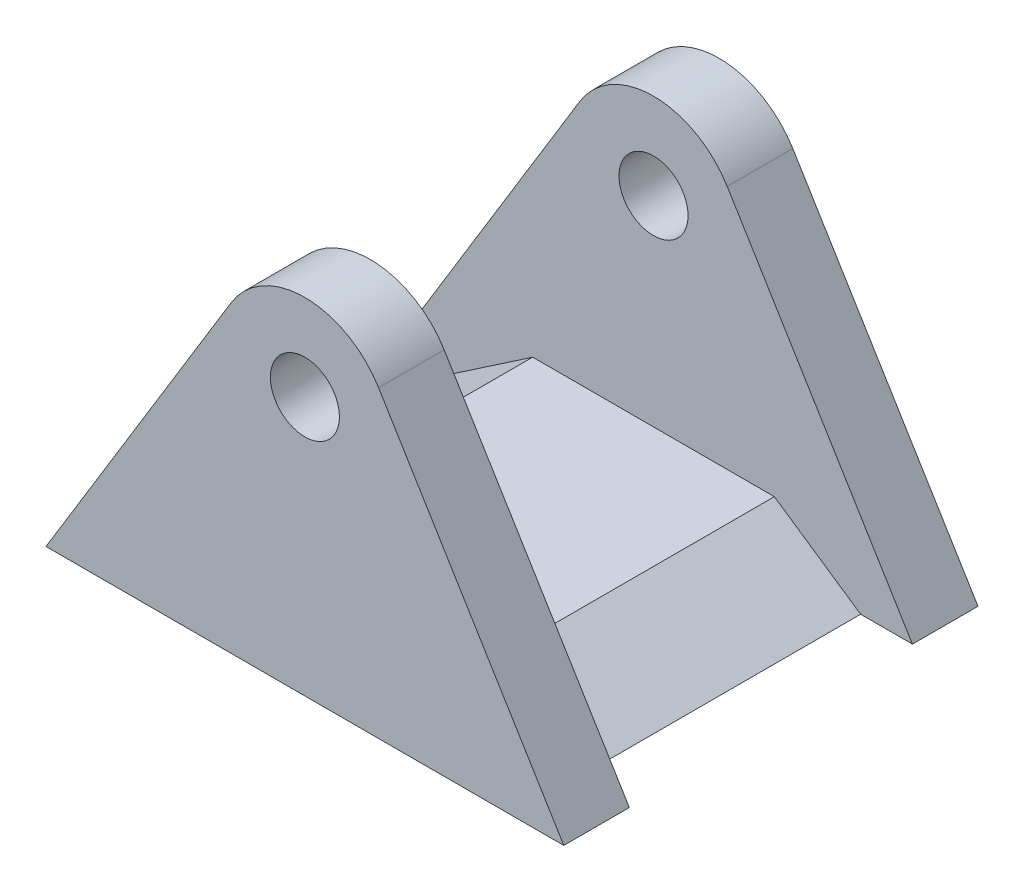
ISO-10303-21;
HEADER;
FILE_DESCRIPTION(('STEP AP214'),'2;1');
FILE_NAME('part.step','',(''),(''),'','','');
FILE_SCHEMA(('AUTOMOTIVE_DESIGN { 1 0 10303 214 1 1 1 1 }'));
ENDSEC;
DATA;
#1=APPLICATION_CONTEXT('core data for automotive mechanical design processes');
#2=APPLICATION_PROTOCOL_DEFINITION('international standard','automotive_design',2000,#1);
#3=PRODUCT_CONTEXT('',#1,'mechanical');
#4=PRODUCT('Part','Part','',(#3));
#5=PRODUCT_RELATED_PRODUCT_CATEGORY('part','',(#4));
#6=PRODUCT_DEFINITION_FORMATION('','',#4);
#7=PRODUCT_DEFINITION_CONTEXT('part definition',#1,'design');
#8=PRODUCT_DEFINITION('design','',#6,#7);
#9=PRODUCT_DEFINITION_SHAPE('','',#8);
#10=(LENGTH_UNIT() NAMED_UNIT(*) SI_UNIT(.MILLI.,.METRE.));
#11=(NAMED_UNIT(*) PLANE_ANGLE_UNIT() SI_UNIT($,.RADIAN.));
#12=(NAMED_UNIT(*) SI_UNIT($,.STERADIAN.) SOLID_ANGLE_UNIT());
#13=UNCERTAINTY_MEASURE_WITH_UNIT(LENGTH_MEASURE(1.E-05),#10,'distance_accuracy_value','');
#14=(GEOMETRIC_REPRESENTATION_CONTEXT(3) GLOBAL_UNCERTAINTY_ASSIGNED_CONTEXT((#13)) GLOBAL_UNIT_ASSIGNED_CONTEXT((#10,
#11,#12)) REPRESENTATION_CONTEXT('',''));
#15=CARTESIAN_POINT('',(0.,0.,0.));
#16=DIRECTION('',(0.,0.,1.));
#17=DIRECTION('',(1.,0.,0.));
#18=AXIS2_PLACEMENT_3D('',#15,#16,#17);
#19=CARTESIAN_POINT('',(1.95,-2.5,-2.));
#20=DIRECTION('',(1.,0.,0.));
#21=DIRECTION('',(0.,1.,0.));
#22=AXIS2_PLACEMENT_3D('',#19,#20,#21);
#23=PLANE('',#22);
#24=DIRECTION('',(0.,-1.,0.));
#25=VECTOR('',#24,1.);
#26=CARTESIAN_POINT('',(1.95,-2.5,1.95));
#27=LINE('',#26,#25);
#28=CARTESIAN_POINT('',(1.95,-1.55559027913422,1.95));
#29=VERTEX_POINT('',#28);
#30=CARTESIAN_POINT('',(1.95,-2.4,1.95));
#31=VERTEX_POINT('',#30);
#32=EDGE_CURVE('E513',#29,#31,#27,.T.);
#33=ORIENTED_EDGE('',*,*,#32,.T.);
#34=DIRECTION('',(0.,0.,1.));
#35=VECTOR('',#34,1.);
#36=CARTESIAN_POINT('',(1.95,-2.4,-2.));
#37=LINE('',#36,#35);
#38=CARTESIAN_POINT('',(1.95,-2.4,-1.95));
#39=VERTEX_POINT('',#38);
#40=EDGE_CURVE('E11',#31,#39,#37,.F.);
#41=ORIENTED_EDGE('',*,*,#40,.T.);
#42=DIRECTION('',(0.,1.,0.));
#43=VECTOR('',#42,1.);
#44=CARTESIAN_POINT('',(1.95,-2.5,-1.95));
#45=LINE('',#44,#43);
#46=CARTESIAN_POINT('',(1.95,-1.55559027913422,-1.95));
#47=VERTEX_POINT('',#46);
#48=EDGE_CURVE('E511',#39,#47,#45,.T.);
#49=ORIENTED_EDGE('',*,*,#48,.T.);
#50=DIRECTION('',(0.,0.,1.));
#51=VECTOR('',#50,1.);
#52=CARTESIAN_POINT('',(1.95,-1.55559027913422,-2.));
#53=LINE('',#52,#51);
#54=EDGE_CURVE('E215',#47,#29,#53,.T.);
#55=ORIENTED_EDGE('',*,*,#54,.T.);
#56=EDGE_LOOP('',(#33,#41,#49,#55));
#57=FACE_BOUND('',#56,.T.);
#58=ADVANCED_FACE('F34',(#57),#23,.T.);
#59=CARTESIAN_POINT('',(1.95,-2.5,-2.));
#60=DIRECTION('',(0.,-1.,0.));
#61=DIRECTION('',(0.,0.,-1.));
#62=AXIS2_PLACEMENT_3D('',#59,#60,#61);
#63=PLANE('',#62);
#64=DIRECTION('',(0.,0.,1.));
#65=VECTOR('',#64,1.);
#66=CARTESIAN_POINT('',(-1.85,-2.5,-2.));
#67=LINE('',#66,#65);
#68=CARTESIAN_POINT('',(-1.85,-2.5,1.85));
#69=VERTEX_POINT('',#68);
#70=CARTESIAN_POINT('',(-1.85,-2.5,-1.85));
#71=VERTEX_POINT('',#70);
#72=EDGE_CURVE('E486',#69,#71,#67,.F.);
#73=ORIENTED_EDGE('',*,*,#72,.T.);
#74=DIRECTION('',(-1.,0.,0.));
#75=VECTOR('',#74,1.);
#76=CARTESIAN_POINT('',(1.95,-2.5,-1.85));
#77=LINE('',#76,#75);
#78=CARTESIAN_POINT('',(1.85,-2.5,-1.85));
#79=VERTEX_POINT('',#78);
#80=EDGE_CURVE('E484',#71,#79,#77,.F.);
#81=ORIENTED_EDGE('',*,*,#80,.T.);
#82=DIRECTION('',(0.,0.,1.));
#83=VECTOR('',#82,1.);
#84=CARTESIAN_POINT('',(1.85,-2.5,-2.));
#85=LINE('',#84,#83);
#86=CARTESIAN_POINT('',(1.85,-2.5,1.85));
#87=VERTEX_POINT('',#86);
#88=EDGE_CURVE('E470',#79,#87,#85,.T.);
#89=ORIENTED_EDGE('',*,*,#88,.T.);
#90=DIRECTION('',(-1.,0.,0.));
#91=VECTOR('',#90,1.);
#92=CARTESIAN_POINT('',(1.95,-2.5,1.85));
#93=LINE('',#92,#91);
#94=EDGE_CURVE('E488',#87,#69,#93,.T.);
#95=ORIENTED_EDGE('',*,*,#94,.T.);
#96=EDGE_LOOP('',(#73,#81,#89,#95));
#97=FACE_BOUND('',#96,.T.);
#98=ADVANCED_FACE('F396',(#97),#63,.T.);
#99=CARTESIAN_POINT('',(-1.95,-2.5,-2.));
#100=DIRECTION('',(-1.,0.,0.));
#101=DIRECTION('',(0.,-1.,0.));
#102=AXIS2_PLACEMENT_3D('',#99,#100,#101);
#103=PLANE('',#102);
#104=DIRECTION('',(0.,-1.,0.));
#105=VECTOR('',#104,1.);
#106=CARTESIAN_POINT('',(-1.95,-2.5,-1.95));
#107=LINE('',#106,#105);
#108=CARTESIAN_POINT('',(-1.95,-1.55559027913422,-1.95));
#109=VERTEX_POINT('',#108);
#110=CARTESIAN_POINT('',(-1.95,-2.4,-1.95));
#111=VERTEX_POINT('',#110);
#112=EDGE_CURVE('E512',#109,#111,#107,.T.);
#113=ORIENTED_EDGE('',*,*,#112,.T.);
#114=DIRECTION('',(0.,0.,1.));
#115=VECTOR('',#114,1.);
#116=CARTESIAN_POINT('',(-1.95,-2.4,-2.));
#117=LINE('',#116,#115);
#118=CARTESIAN_POINT('',(-1.95,-2.4,1.95));
#119=VERTEX_POINT('',#118);
#120=EDGE_CURVE('E58',#111,#119,#117,.T.);
#121=ORIENTED_EDGE('',*,*,#120,.T.);
#122=DIRECTION('',(0.,1.,0.));
#123=VECTOR('',#122,1.);
#124=CARTESIAN_POINT('',(-1.95,-2.5,1.95));
#125=LINE('',#124,#123);
#126=CARTESIAN_POINT('',(-1.95,-1.55559027913422,1.95));
#127=VERTEX_POINT('',#126);
#128=EDGE_CURVE('E517',#119,#127,#125,.T.);
#129=ORIENTED_EDGE('',*,*,#128,.T.);
#130=DIRECTION('',(0.,0.,1.));
#131=VECTOR('',#130,1.);
#132=CARTESIAN_POINT('',(-1.95,-1.55559027913422,-2.));
#133=LINE('',#132,#131);
#134=EDGE_CURVE('E229',#109,#127,#133,.T.);
#135=ORIENTED_EDGE('',*,*,#134,.F.);
#136=EDGE_LOOP('',(#113,#121,#129,#135));
#137=FACE_BOUND('',#136,.T.);
#138=ADVANCED_FACE('F402',(#137),#103,.T.);
#139=CARTESIAN_POINT('',(0.,-2.,-2.));
#140=DIRECTION('',(0.,0.,1.));
#141=DIRECTION('',(1.,0.,0.));
#142=AXIS2_PLACEMENT_3D('',#139,#140,#141);
#143=CYLINDRICAL_SURFACE('',#142,2.);
#144=ORIENTED_EDGE('',*,*,#134,.T.);
#145=CARTESIAN_POINT('',(0.,-2.,0.));
#146=DIRECTION('',(0.707106781186547,0.,0.707106781186547));
#147=DIRECTION('',(-0.707106781186547,0.,0.707106781186547));
#148=AXIS2_PLACEMENT_3D('',#145,#146,#147);
#149=ELLIPSE('',#148,2.82842712474619,2.);
#150=CARTESIAN_POINT('',(-1.5,-0.677124344467705,1.5));
#151=VERTEX_POINT('',#150);
#152=EDGE_CURVE('E539',#127,#151,#149,.F.);
#153=ORIENTED_EDGE('',*,*,#152,.T.);
#154=DIRECTION('',(0.,0.,1.));
#155=VECTOR('',#154,1.);
#156=CARTESIAN_POINT('',(-1.5,-0.677124344467705,-2.));
#157=LINE('',#156,#155);
#158=CARTESIAN_POINT('',(-1.5,-0.677124344467704,-1.5));
#159=VERTEX_POINT('',#158);
#160=EDGE_CURVE('E213',#159,#151,#157,.T.);
#161=ORIENTED_EDGE('',*,*,#160,.F.);
#162=CARTESIAN_POINT('',(0.,-2.,0.));
#163=DIRECTION('',(-0.707106781186547,0.,0.707106781186547));
#164=DIRECTION('',(0.707106781186547,0.,0.707106781186547));
#165=AXIS2_PLACEMENT_3D('',#162,#163,#164);
#166=ELLIPSE('',#165,2.82842712474619,2.);
#167=EDGE_CURVE('E524',#159,#109,#166,.T.);
#168=ORIENTED_EDGE('',*,*,#167,.T.);
#169=EDGE_LOOP('',(#144,#153,#161,#168));
#170=FACE_BOUND('',#169,.T.);
#171=ADVANCED_FACE('F536',(#170),#143,.T.);
#172=CARTESIAN_POINT('',(-1.5,0.,-2.));
#173=DIRECTION('',(-1.,0.,0.));
#174=DIRECTION('',(0.,-1.,0.));
#175=AXIS2_PLACEMENT_3D('',#172,#173,#174);
#176=PLANE('',#175);
#177=ORIENTED_EDGE('',*,*,#160,.T.);
#178=DIRECTION('',(0.,1.,0.));
#179=VECTOR('',#178,1.);
#180=CARTESIAN_POINT('',(-1.5,0.,1.5));
#181=LINE('',#180,#179);
#182=CARTESIAN_POINT('',(-1.5,0.,1.5));
#183=VERTEX_POINT('',#182);
#184=EDGE_CURVE('E195',#151,#183,#181,.T.);
#185=ORIENTED_EDGE('',*,*,#184,.T.);
#186=DIRECTION('',(0.,0.,1.));
#187=VECTOR('',#186,1.);
#188=CARTESIAN_POINT('',(-1.5,0.,-2.));
#189=LINE('',#188,#187);
#190=CARTESIAN_POINT('',(-1.5,0.,-1.5));
#191=VERTEX_POINT('',#190);
#192=EDGE_CURVE('E206',#191,#183,#189,.T.);
#193=ORIENTED_EDGE('',*,*,#192,.F.);
#194=DIRECTION('',(0.,-1.,0.));
#195=VECTOR('',#194,1.);
#196=CARTESIAN_POINT('',(-1.5,0.,-1.5));
#197=LINE('',#196,#195);
#198=EDGE_CURVE('E221',#191,#159,#197,.T.);
#199=ORIENTED_EDGE('',*,*,#198,.T.);
#200=EDGE_LOOP('',(#177,#185,#193,#199));
#201=FACE_BOUND('',#200,.T.);
#202=ADVANCED_FACE('F533',(#201),#176,.T.);
#203=CARTESIAN_POINT('',(1.5,0.,-2.));
#204=DIRECTION('',(1.,0.,0.));
#205=DIRECTION('',(0.,1.,0.));
#206=AXIS2_PLACEMENT_3D('',#203,#204,#205);
#207=PLANE('',#206);
#208=DIRECTION('',(0.,0.,1.));
#209=VECTOR('',#208,1.);
#210=CARTESIAN_POINT('',(1.5,0.,-2.));
#211=LINE('',#210,#209);
#212=CARTESIAN_POINT('',(1.5,0.,-1.5));
#213=VERTEX_POINT('',#212);
#214=CARTESIAN_POINT('',(1.5,0.,1.5));
#215=VERTEX_POINT('',#214);
#216=EDGE_CURVE('E204',#213,#215,#211,.T.);
#217=ORIENTED_EDGE('',*,*,#216,.T.);
#218=DIRECTION('',(0.,-1.,0.));
#219=VECTOR('',#218,1.);
#220=CARTESIAN_POINT('',(1.5,0.,1.5));
#221=LINE('',#220,#219);
#222=CARTESIAN_POINT('',(1.5,-0.677124344467705,1.5));
#223=VERTEX_POINT('',#222);
#224=EDGE_CURVE('E184',#215,#223,#221,.T.);
#225=ORIENTED_EDGE('',*,*,#224,.T.);
#226=DIRECTION('',(0.,0.,1.));
#227=VECTOR('',#226,1.);
#228=CARTESIAN_POINT('',(1.5,-0.677124344467705,-2.));
#229=LINE('',#228,#227);
#230=CARTESIAN_POINT('',(1.5,-0.677124344467704,-1.5));
#231=VERTEX_POINT('',#230);
#232=EDGE_CURVE('E211',#231,#223,#229,.T.);
#233=ORIENTED_EDGE('',*,*,#232,.F.);
#234=DIRECTION('',(0.,1.,0.));
#235=VECTOR('',#234,1.);
#236=CARTESIAN_POINT('',(1.5,0.,-1.5));
#237=LINE('',#236,#235);
#238=EDGE_CURVE('E210',#231,#213,#237,.T.);
#239=ORIENTED_EDGE('',*,*,#238,.T.);
#240=EDGE_LOOP('',(#217,#225,#233,#239));
#241=FACE_BOUND('',#240,.T.);
#242=ADVANCED_FACE('F209',(#241),#207,.T.);
#243=CARTESIAN_POINT('',(0.,-2.,-2.));
#244=DIRECTION('',(0.,0.,1.));
#245=DIRECTION('',(1.,0.,0.));
#246=AXIS2_PLACEMENT_3D('',#243,#244,#245);
#247=CYLINDRICAL_SURFACE('',#246,2.);
#248=ORIENTED_EDGE('',*,*,#232,.T.);
#249=CARTESIAN_POINT('',(0.,-2.,0.));
#250=DIRECTION('',(-0.707106781186547,0.,0.707106781186547));
#251=DIRECTION('',(0.707106781186547,0.,0.707106781186547));
#252=AXIS2_PLACEMENT_3D('',#249,#250,#251);
#253=ELLIPSE('',#252,2.82842712474619,2.);
#254=EDGE_CURVE('E493',#223,#29,#253,.F.);
#255=ORIENTED_EDGE('',*,*,#254,.T.);
#256=ORIENTED_EDGE('',*,*,#54,.F.);
#257=CARTESIAN_POINT('',(0.,-2.,0.));
#258=DIRECTION('',(0.707106781186547,0.,0.707106781186547));
#259=DIRECTION('',(-0.707106781186547,0.,0.707106781186547));
#260=AXIS2_PLACEMENT_3D('',#257,#258,#259);
#261=ELLIPSE('',#260,2.82842712474619,2.);
#262=EDGE_CURVE('E307',#47,#231,#261,.T.);
#263=ORIENTED_EDGE('',*,*,#262,.T.);
#264=EDGE_LOOP('',(#248,#255,#256,#263));
#265=FACE_BOUND('',#264,.T.);
#266=ADVANCED_FACE('F407',(#265),#247,.T.);
#267=CARTESIAN_POINT('',(-3.5,1.7,-4.1));
#268=DIRECTION('',(-0.562310021407279,0.826926502069528,0.));
#269=DIRECTION('',(-0.826926502069528,-0.562310021407279,0.));
#270=AXIS2_PLACEMENT_3D('',#267,#268,#269);
#271=PLANE('',#270);
#272=DIRECTION('',(0.,0.,1.));
#273=VECTOR('',#272,1.);
#274=CARTESIAN_POINT('',(-6.,0.,-4.1));
#275=LINE('',#274,#273);
#276=CARTESIAN_POINT('',(-6.,0.,-4.1));
#277=VERTEX_POINT('',#276);
#278=CARTESIAN_POINT('',(-6.,0.,4.1));
#279=VERTEX_POINT('',#278);
#280=EDGE_CURVE('E279',#277,#279,#275,.T.);
#281=ORIENTED_EDGE('',*,*,#280,.T.);
#282=DIRECTION('',(-0.826926502069528,-0.562310021407279,0.));
#283=VECTOR('',#282,1.);
#284=CARTESIAN_POINT('',(-3.5,1.7,4.1));
#285=LINE('',#284,#283);
#286=CARTESIAN_POINT('',(-3.5,1.7,4.1));
#287=VERTEX_POINT('',#286);
#288=EDGE_CURVE('E321',#287,#279,#285,.T.);
#289=ORIENTED_EDGE('',*,*,#288,.F.);
#290=DIRECTION('',(0.,0.,1.));
#291=VECTOR('',#290,1.);
#292=CARTESIAN_POINT('',(-3.5,1.7,-4.1));
#293=LINE('',#292,#291);
#294=CARTESIAN_POINT('',(-3.5,1.7,-4.1));
#295=VERTEX_POINT('',#294);
#296=EDGE_CURVE('E293',#295,#287,#293,.T.);
#297=ORIENTED_EDGE('',*,*,#296,.F.);
#298=DIRECTION('',(-0.826926502069528,-0.562310021407279,0.));
#299=VECTOR('',#298,1.);
#300=CARTESIAN_POINT('',(-3.5,1.7,-4.1));
#301=LINE('',#300,#299);
#302=EDGE_CURVE('E290',#295,#277,#301,.T.);
#303=ORIENTED_EDGE('',*,*,#302,.T.);
#304=EDGE_LOOP('',(#281,#289,#297,#303));
#305=FACE_BOUND('',#304,.T.);
#306=ADVANCED_FACE('F291',(#305),#271,.T.);
#307=CARTESIAN_POINT('',(-3.5,1.7,-4.1));
#308=DIRECTION('',(0.,1.,0.));
#309=DIRECTION('',(0.,0.,1.));
#310=AXIS2_PLACEMENT_3D('',#307,#308,#309);
#311=PLANE('',#310);
#312=ORIENTED_EDGE('',*,*,#296,.T.);
#313=DIRECTION('',(-1.,0.,0.));
#314=VECTOR('',#313,1.);
#315=CARTESIAN_POINT('',(-3.5,1.7,4.1));
#316=LINE('',#315,#314);
#317=CARTESIAN_POINT('',(3.5,1.7,4.1));
#318=VERTEX_POINT('',#317);
#319=EDGE_CURVE('E296',#318,#287,#316,.T.);
#320=ORIENTED_EDGE('',*,*,#319,.F.);
#321=DIRECTION('',(0.,0.,1.));
#322=VECTOR('',#321,1.);
#323=CARTESIAN_POINT('',(3.5,1.7,-4.1));
#324=LINE('',#323,#322);
#325=CARTESIAN_POINT('',(3.5,1.7,-4.1));
#326=VERTEX_POINT('',#325);
#327=EDGE_CURVE('E314',#326,#318,#324,.T.);
#328=ORIENTED_EDGE('',*,*,#327,.F.);
#329=DIRECTION('',(-1.,0.,0.));
#330=VECTOR('',#329,1.);
#331=CARTESIAN_POINT('',(-3.5,1.7,-4.1));
#332=LINE('',#331,#330);
#333=EDGE_CURVE('E287',#326,#295,#332,.T.);
#334=ORIENTED_EDGE('',*,*,#333,.T.);
#335=EDGE_LOOP('',(#312,#320,#328,#334));
#336=FACE_BOUND('',#335,.T.);
#337=ADVANCED_FACE('F437',(#336),#311,.T.);
#338=CARTESIAN_POINT('',(3.5,1.7,-4.1));
#339=DIRECTION('',(0.562310021407279,0.826926502069528,0.));
#340=DIRECTION('',(-0.826926502069528,0.562310021407279,0.));
#341=AXIS2_PLACEMENT_3D('',#338,#339,#340);
#342=PLANE('',#341);
#343=ORIENTED_EDGE('',*,*,#327,.T.);
#344=DIRECTION('',(-0.826926502069528,0.562310021407279,0.));
#345=VECTOR('',#344,1.);
#346=CARTESIAN_POINT('',(3.5,1.7,4.1));
#347=LINE('',#346,#345);
#348=CARTESIAN_POINT('',(6.,0.,4.1));
#349=VERTEX_POINT('',#348);
#350=EDGE_CURVE('E301',#349,#318,#347,.T.);
#351=ORIENTED_EDGE('',*,*,#350,.F.);
#352=DIRECTION('',(0.,0.,1.));
#353=VECTOR('',#352,1.);
#354=CARTESIAN_POINT('',(6.,0.,-4.1));
#355=LINE('',#354,#353);
#356=CARTESIAN_POINT('',(6.,0.,-4.1));
#357=VERTEX_POINT('',#356);
#358=EDGE_CURVE('E286',#357,#349,#355,.T.);
#359=ORIENTED_EDGE('',*,*,#358,.F.);
#360=DIRECTION('',(-0.826926502069528,0.562310021407279,0.));
#361=VECTOR('',#360,1.);
#362=CARTESIAN_POINT('',(3.5,1.7,-4.1));
#363=LINE('',#362,#361);
#364=EDGE_CURVE('E295',#357,#326,#363,.T.);
#365=ORIENTED_EDGE('',*,*,#364,.T.);
#366=EDGE_LOOP('',(#343,#351,#359,#365));
#367=FACE_BOUND('',#366,.T.);
#368=ADVANCED_FACE('F433',(#367),#342,.T.);
#369=CARTESIAN_POINT('',(-6.,0.,-4.1));
#370=DIRECTION('',(0.,-1.,0.));
#371=DIRECTION('',(0.,0.,-1.));
#372=AXIS2_PLACEMENT_3D('',#369,#370,#371);
#373=PLANE('',#372);
#374=DIRECTION('',(-1.,0.,0.));
#375=VECTOR('',#374,1.);
#376=CARTESIAN_POINT('',(2.,0.,1.5));
#377=LINE('',#376,#375);
#378=EDGE_CURVE('E187',#215,#183,#377,.T.);
#379=ORIENTED_EDGE('',*,*,#378,.F.);
#380=ORIENTED_EDGE('',*,*,#216,.F.);
#381=DIRECTION('',(-1.,0.,0.));
#382=VECTOR('',#381,1.);
#383=CARTESIAN_POINT('',(2.,0.,-1.5));
#384=LINE('',#383,#382);
#385=EDGE_CURVE('E515',#213,#191,#384,.T.);
#386=ORIENTED_EDGE('',*,*,#385,.T.);
#387=ORIENTED_EDGE('',*,*,#192,.T.);
#388=EDGE_LOOP('',(#379,#380,#386,#387));
#389=FACE_BOUND('',#388,.T.);
#390=ORIENTED_EDGE('',*,*,#358,.T.);
#391=DIRECTION('',(1.,0.,0.));
#392=VECTOR('',#391,1.);
#393=CARTESIAN_POINT('',(0.,0.,4.1));
#394=LINE('',#393,#392);
#395=CARTESIAN_POINT('',(7.5,0.,4.1));
#396=VERTEX_POINT('',#395);
#397=EDGE_CURVE('E329',#349,#396,#394,.T.);
#398=ORIENTED_EDGE('',*,*,#397,.T.);
#399=DIRECTION('',(0.,0.,-1.));
#400=VECTOR('',#399,1.);
#401=CARTESIAN_POINT('',(7.5,0.,6.));
#402=LINE('',#401,#400);
#403=CARTESIAN_POINT('',(7.5,0.,6.));
#404=VERTEX_POINT('',#403);
#405=EDGE_CURVE('E326',#404,#396,#402,.T.);
#406=ORIENTED_EDGE('',*,*,#405,.F.);
#407=DIRECTION('',(1.,0.,0.));
#408=VECTOR('',#407,1.);
#409=CARTESIAN_POINT('',(0.,0.,6.));
#410=LINE('',#409,#408);
#411=CARTESIAN_POINT('',(-7.5,0.,6.));
#412=VERTEX_POINT('',#411);
#413=EDGE_CURVE('E356',#412,#404,#410,.T.);
#414=ORIENTED_EDGE('',*,*,#413,.F.);
#415=DIRECTION('',(0.,0.,-1.));
#416=VECTOR('',#415,1.);
#417=CARTESIAN_POINT('',(-7.5,0.,6.));
#418=LINE('',#417,#416);
#419=CARTESIAN_POINT('',(-7.5,0.,4.1));
#420=VERTEX_POINT('',#419);
#421=EDGE_CURVE('E338',#412,#420,#418,.T.);
#422=ORIENTED_EDGE('',*,*,#421,.T.);
#423=EDGE_CURVE('E283',#420,#279,#394,.T.);
#424=ORIENTED_EDGE('',*,*,#423,.T.);
#425=ORIENTED_EDGE('',*,*,#280,.F.);
#426=DIRECTION('',(1.,0.,0.));
#427=VECTOR('',#426,1.);
#428=CARTESIAN_POINT('',(0.,0.,-4.1));
#429=LINE('',#428,#427);
#430=CARTESIAN_POINT('',(-7.5,0.,-4.1));
#431=VERTEX_POINT('',#430);
#432=EDGE_CURVE('E252',#431,#277,#429,.T.);
#433=ORIENTED_EDGE('',*,*,#432,.F.);
#434=DIRECTION('',(0.,0.,1.));
#435=VECTOR('',#434,1.);
#436=CARTESIAN_POINT('',(-7.5,0.,-6.));
#437=LINE('',#436,#435);
#438=CARTESIAN_POINT('',(-7.5,0.,-6.));
#439=VERTEX_POINT('',#438);
#440=EDGE_CURVE('E254',#439,#431,#437,.T.);
#441=ORIENTED_EDGE('',*,*,#440,.F.);
#442=DIRECTION('',(1.,0.,0.));
#443=VECTOR('',#442,1.);
#444=CARTESIAN_POINT('',(0.,0.,-6.));
#445=LINE('',#444,#443);
#446=CARTESIAN_POINT('',(7.5,0.,-6.));
#447=VERTEX_POINT('',#446);
#448=EDGE_CURVE('E230',#439,#447,#445,.T.);
#449=ORIENTED_EDGE('',*,*,#448,.T.);
#450=DIRECTION('',(0.,0.,1.));
#451=VECTOR('',#450,1.);
#452=CARTESIAN_POINT('',(7.5,0.,-6.));
#453=LINE('',#452,#451);
#454=CARTESIAN_POINT('',(7.5,0.,-4.1));
#455=VERTEX_POINT('',#454);
#456=EDGE_CURVE('E243',#447,#455,#453,.T.);
#457=ORIENTED_EDGE('',*,*,#456,.T.);
#458=EDGE_CURVE('E225',#357,#455,#429,.T.);
#459=ORIENTED_EDGE('',*,*,#458,.F.);
#460=EDGE_LOOP('',(#390,#398,#406,#414,#422,#424,#425,#433,#441,#449,#457,#459));
#461=FACE_BOUND('',#460,.T.);
#462=ADVANCED_FACE('F201',(#389,#461),#373,.T.);
#463=CARTESIAN_POINT('',(0.,7.5,4.1));
#464=DIRECTION('',(0.,0.,1.));
#465=DIRECTION('',(1.,0.,0.));
#466=AXIS2_PLACEMENT_3D('',#463,#464,#465);
#467=PLANE('',#466);
#468=CARTESIAN_POINT('',(0.,7.5,4.1));
#469=DIRECTION('',(0.,0.,1.));
#470=DIRECTION('',(1.,0.,0.));
#471=AXIS2_PLACEMENT_3D('',#468,#469,#470);
#472=CIRCLE('',#471,1.);
#473=CARTESIAN_POINT('',(-1.,7.5,4.1));
#474=VERTEX_POINT('',#473);
#475=EDGE_CURVE('E256',#474,#474,#472,.T.);
#476=ORIENTED_EDGE('',*,*,#475,.T.);
#477=EDGE_LOOP('',(#476));
#478=FACE_BOUND('',#477,.T.);
#479=ORIENTED_EDGE('',*,*,#319,.T.);
#480=ORIENTED_EDGE('',*,*,#288,.T.);
#481=ORIENTED_EDGE('',*,*,#423,.F.);
#482=DIRECTION('',(-0.52051760426961,-0.853850937602944,0.));
#483=VECTOR('',#482,1.);
#484=CARTESIAN_POINT('',(-7.5,0.,4.1));
#485=LINE('',#484,#483);
#486=CARTESIAN_POINT('',(-2.13462734400736,8.80129401067403,4.1));
#487=VERTEX_POINT('',#486);
#488=EDGE_CURVE('E332',#487,#420,#485,.T.);
#489=ORIENTED_EDGE('',*,*,#488,.F.);
#490=CARTESIAN_POINT('',(0.,7.5,4.1));
#491=DIRECTION('',(0.,0.,1.));
#492=DIRECTION('',(1.,0.,0.));
#493=AXIS2_PLACEMENT_3D('',#490,#491,#492);
#494=CIRCLE('',#493,2.5);
#495=CARTESIAN_POINT('',(2.13462734400736,8.80129401067403,4.1));
#496=VERTEX_POINT('',#495);
#497=EDGE_CURVE('E366',#496,#487,#494,.T.);
#498=ORIENTED_EDGE('',*,*,#497,.F.);
#499=DIRECTION('',(-0.52051760426961,0.853850937602943,0.));
#500=VECTOR('',#499,1.);
#501=CARTESIAN_POINT('',(7.5,0.,4.1));
#502=LINE('',#501,#500);
#503=EDGE_CURVE('E353',#396,#496,#502,.T.);
#504=ORIENTED_EDGE('',*,*,#503,.F.);
#505=ORIENTED_EDGE('',*,*,#397,.F.);
#506=ORIENTED_EDGE('',*,*,#350,.T.);
#507=EDGE_LOOP('',(#479,#480,#481,#489,#498,#504,#505,#506));
#508=FACE_BOUND('',#507,.T.);
#509=ADVANCED_FACE('F364',(#478,#508),#467,.F.);
#510=CARTESIAN_POINT('',(0.,7.5,6.));
#511=DIRECTION('',(0.,0.,1.));
#512=DIRECTION('',(1.,0.,0.));
#513=AXIS2_PLACEMENT_3D('',#510,#511,#512);
#514=PLANE('',#513);
#515=ORIENTED_EDGE('',*,*,#413,.T.);
#516=DIRECTION('',(-0.52051760426961,0.853850937602943,0.));
#517=VECTOR('',#516,1.);
#518=CARTESIAN_POINT('',(7.5,0.,6.));
#519=LINE('',#518,#517);
#520=CARTESIAN_POINT('',(2.13462734400736,8.80129401067403,6.));
#521=VERTEX_POINT('',#520);
#522=EDGE_CURVE('E354',#404,#521,#519,.T.);
#523=ORIENTED_EDGE('',*,*,#522,.T.);
#524=CARTESIAN_POINT('',(0.,7.5,6.));
#525=DIRECTION('',(0.,0.,1.));
#526=DIRECTION('',(1.,0.,0.));
#527=AXIS2_PLACEMENT_3D('',#524,#525,#526);
#528=CIRCLE('',#527,2.5);
#529=CARTESIAN_POINT('',(-2.13462734400736,8.80129401067403,6.));
#530=VERTEX_POINT('',#529);
#531=EDGE_CURVE('E372',#521,#530,#528,.T.);
#532=ORIENTED_EDGE('',*,*,#531,.T.);
#533=DIRECTION('',(-0.52051760426961,-0.853850937602944,0.));
#534=VECTOR('',#533,1.);
#535=CARTESIAN_POINT('',(-7.5,0.,6.));
#536=LINE('',#535,#534);
#537=EDGE_CURVE('E342',#530,#412,#536,.T.);
#538=ORIENTED_EDGE('',*,*,#537,.T.);
#539=EDGE_LOOP('',(#515,#523,#532,#538));
#540=FACE_BOUND('',#539,.T.);
#541=CARTESIAN_POINT('',(0.,7.5,6.));
#542=DIRECTION('',(0.,0.,1.));
#543=DIRECTION('',(1.,0.,0.));
#544=AXIS2_PLACEMENT_3D('',#541,#542,#543);
#545=CIRCLE('',#544,1.);
#546=CARTESIAN_POINT('',(-1.,7.5,6.));
#547=VERTEX_POINT('',#546);
#548=EDGE_CURVE('E367',#547,#547,#545,.T.);
#549=ORIENTED_EDGE('',*,*,#548,.F.);
#550=EDGE_LOOP('',(#549));
#551=FACE_BOUND('',#550,.T.);
#552=ADVANCED_FACE('F741',(#540,#551),#514,.T.);
#553=CARTESIAN_POINT('',(7.5,0.,6.));
#554=DIRECTION('',(-0.853850937602943,-0.52051760426961,0.));
#555=DIRECTION('',(0.52051760426961,-0.853850937602943,0.));
#556=AXIS2_PLACEMENT_3D('',#553,#554,#555);
#557=PLANE('',#556);
#558=ORIENTED_EDGE('',*,*,#503,.T.);
#559=DIRECTION('',(0.,0.,-1.));
#560=VECTOR('',#559,1.);
#561=CARTESIAN_POINT('',(2.13462734400736,8.80129401067403,6.));
#562=LINE('',#561,#560);
#563=EDGE_CURVE('E345',#521,#496,#562,.T.);
#564=ORIENTED_EDGE('',*,*,#563,.F.);
#565=ORIENTED_EDGE('',*,*,#522,.F.);
#566=ORIENTED_EDGE('',*,*,#405,.T.);
#567=EDGE_LOOP('',(#558,#564,#565,#566));
#568=FACE_BOUND('',#567,.T.);
#569=ADVANCED_FACE('F350',(#568),#557,.F.);
#570=CARTESIAN_POINT('',(0.,7.5,6.));
#571=DIRECTION('',(0.,0.,-1.));
#572=DIRECTION('',(-1.,0.,0.));
#573=AXIS2_PLACEMENT_3D('',#570,#571,#572);
#574=CYLINDRICAL_SURFACE('',#573,2.5);
#575=ORIENTED_EDGE('',*,*,#497,.T.);
#576=DIRECTION('',(0.,0.,-1.));
#577=VECTOR('',#576,1.);
#578=CARTESIAN_POINT('',(-2.13462734400736,8.80129401067403,6.));
#579=LINE('',#578,#577);
#580=EDGE_CURVE('E341',#530,#487,#579,.T.);
#581=ORIENTED_EDGE('',*,*,#580,.F.);
#582=ORIENTED_EDGE('',*,*,#531,.F.);
#583=ORIENTED_EDGE('',*,*,#563,.T.);
#584=EDGE_LOOP('',(#575,#581,#582,#583));
#585=FACE_BOUND('',#584,.T.);
#586=ADVANCED_FACE('F391',(#585),#574,.T.);
#587=CARTESIAN_POINT('',(-7.5,0.,6.));
#588=DIRECTION('',(0.853850937602943,-0.52051760426961,0.));
#589=DIRECTION('',(0.52051760426961,0.853850937602944,0.));
#590=AXIS2_PLACEMENT_3D('',#587,#588,#589);
#591=PLANE('',#590);
#592=ORIENTED_EDGE('',*,*,#488,.T.);
#593=ORIENTED_EDGE('',*,*,#421,.F.);
#594=ORIENTED_EDGE('',*,*,#537,.F.);
#595=ORIENTED_EDGE('',*,*,#580,.T.);
#596=EDGE_LOOP('',(#592,#593,#594,#595));
#597=FACE_BOUND('',#596,.T.);
#598=ADVANCED_FACE('F382',(#597),#591,.F.);
#599=CARTESIAN_POINT('',(0.,7.5,6.));
#600=DIRECTION('',(0.,0.,-1.));
#601=DIRECTION('',(-1.,0.,0.));
#602=AXIS2_PLACEMENT_3D('',#599,#600,#601);
#603=CYLINDRICAL_SURFACE('',#602,1.);
#604=CARTESIAN_POINT('',(-1.,7.5,6.));
#605=CARTESIAN_POINT('',(-1.,7.5,5.98020833333333));
#606=CARTESIAN_POINT('',(-1.,7.5,5.96041666666667));
#607=CARTESIAN_POINT('',(-1.,7.5,5.92083333333333));
#608=CARTESIAN_POINT('',(-1.,7.5,5.90104166666667));
#609=CARTESIAN_POINT('',(-1.,7.5,5.86145833333333));
#610=CARTESIAN_POINT('',(-1.,7.5,5.84166666666667));
#611=CARTESIAN_POINT('',(-1.,7.5,5.80208333333333));
#612=CARTESIAN_POINT('',(-1.,7.5,5.78229166666667));
#613=CARTESIAN_POINT('',(-1.,7.5,5.74270833333333));
#614=CARTESIAN_POINT('',(-1.,7.5,5.72291666666667));
#615=CARTESIAN_POINT('',(-1.,7.5,5.68333333333333));
#616=CARTESIAN_POINT('',(-1.,7.5,5.66354166666667));
#617=CARTESIAN_POINT('',(-1.,7.5,5.62395833333333));
#618=CARTESIAN_POINT('',(-1.,7.5,5.60416666666667));
#619=CARTESIAN_POINT('',(-1.,7.5,5.56458333333333));
#620=CARTESIAN_POINT('',(-1.,7.5,5.54479166666667));
#621=CARTESIAN_POINT('',(-1.,7.5,5.50520833333333));
#622=CARTESIAN_POINT('',(-1.,7.5,5.48541666666667));
#623=CARTESIAN_POINT('',(-1.,7.5,5.44583333333333));
#624=CARTESIAN_POINT('',(-1.,7.5,5.42604166666667));
#625=CARTESIAN_POINT('',(-1.,7.5,5.38645833333333));
#626=CARTESIAN_POINT('',(-1.,7.5,5.36666666666667));
#627=CARTESIAN_POINT('',(-1.,7.5,5.32708333333333));
#628=CARTESIAN_POINT('',(-1.,7.5,5.30729166666667));
#629=CARTESIAN_POINT('',(-1.,7.5,5.26770833333333));
#630=CARTESIAN_POINT('',(-1.,7.5,5.24791666666667));
#631=CARTESIAN_POINT('',(-1.,7.5,5.20833333333333));
#632=CARTESIAN_POINT('',(-1.,7.5,5.18854166666666));
#633=CARTESIAN_POINT('',(-1.,7.5,5.14895833333333));
#634=CARTESIAN_POINT('',(-1.,7.5,5.12916666666667));
#635=CARTESIAN_POINT('',(-1.,7.5,5.08958333333333));
#636=CARTESIAN_POINT('',(-1.,7.5,5.06979166666667));
#637=CARTESIAN_POINT('',(-1.,7.5,5.03020833333333));
#638=CARTESIAN_POINT('',(-1.,7.5,5.01041666666667));
#639=CARTESIAN_POINT('',(-1.,7.5,4.97083333333333));
#640=CARTESIAN_POINT('',(-1.,7.5,4.95104166666667));
#641=CARTESIAN_POINT('',(-1.,7.5,4.91145833333333));
#642=CARTESIAN_POINT('',(-1.,7.5,4.89166666666667));
#643=CARTESIAN_POINT('',(-1.,7.5,4.85208333333333));
#644=CARTESIAN_POINT('',(-1.,7.5,4.83229166666667));
#645=CARTESIAN_POINT('',(-1.,7.5,4.79270833333333));
#646=CARTESIAN_POINT('',(-1.,7.5,4.77291666666667));
#647=CARTESIAN_POINT('',(-1.,7.5,4.73333333333333));
#648=CARTESIAN_POINT('',(-1.,7.5,4.71354166666667));
#649=CARTESIAN_POINT('',(-1.,7.5,4.67395833333333));
#650=CARTESIAN_POINT('',(-1.,7.5,4.65416666666667));
#651=CARTESIAN_POINT('',(-1.,7.5,4.61458333333333));
#652=CARTESIAN_POINT('',(-1.,7.5,4.59479166666667));
#653=CARTESIAN_POINT('',(-1.,7.5,4.55520833333333));
#654=CARTESIAN_POINT('',(-1.,7.5,4.53541666666667));
#655=CARTESIAN_POINT('',(-1.,7.5,4.49583333333333));
#656=CARTESIAN_POINT('',(-1.,7.5,4.47604166666667));
#657=CARTESIAN_POINT('',(-1.,7.5,4.43645833333333));
#658=CARTESIAN_POINT('',(-1.,7.5,4.41666666666667));
#659=CARTESIAN_POINT('',(-1.,7.5,4.37708333333333));
#660=CARTESIAN_POINT('',(-1.,7.5,4.35729166666667));
#661=CARTESIAN_POINT('',(-1.,7.5,4.31770833333333));
#662=CARTESIAN_POINT('',(-1.,7.5,4.29791666666667));
#663=CARTESIAN_POINT('',(-1.,7.5,4.25833333333333));
#664=CARTESIAN_POINT('',(-1.,7.5,4.23854166666667));
#665=CARTESIAN_POINT('',(-1.,7.5,4.19895833333333));
#666=CARTESIAN_POINT('',(-1.,7.5,4.17916666666667));
#667=CARTESIAN_POINT('',(-1.,7.5,4.13958333333333));
#668=CARTESIAN_POINT('',(-1.,7.5,4.11979166666667));
#669=CARTESIAN_POINT('',(-1.,7.5,4.1));
#670=B_SPLINE_CURVE_WITH_KNOTS('',3,(#604,#605,#606,#607,#608,#609,#610,#611,#612,#613,#614,
#615,#616,#617,#618,#619,#620,#621,#622,#623,#624,#625,#626,#627,#628,#629,#630,#631,#632,#633,
#634,#635,#636,#637,#638,#639,#640,#641,#642,#643,#644,#645,#646,#647,#648,#649,#650,#651,#652,
#653,#654,#655,#656,#657,#658,#659,#660,#661,#662,#663,#664,#665,#666,#667,#668,#669),
.UNSPECIFIED.,.F.,.F.,(4,2,2,2,2,2,2,2,2,2,2,2,2,2,2,2,2,2,2,2,2,2,2,2,2,2,2,2,2,2,2,2,4),(0.,
0.0593750000000004,0.118750000000001,0.178125,0.237500000000001,0.296875,0.356250000000001,
0.415625,0.475000000000001,0.534375,0.593750000000001,0.653125,0.7125,0.771875000000001,0.83125,
0.890625000000001,0.95,1.009375,1.06875,1.128125,1.1875,1.246875,1.30625,1.365625,1.425,
1.484375,1.54375,1.603125,1.6625,1.721875,1.78125,1.840625,1.9),.UNSPECIFIED.);
#671=EDGE_CURVE('BSEAM380',#547,#474,#670,.T.);
#672=ORIENTED_EDGE('',*,*,#548,.T.);
#673=ORIENTED_EDGE('',*,*,#475,.F.);
#674=ORIENTED_EDGE('',*,*,#671,.T.);
#675=ORIENTED_EDGE('',*,*,#671,.F.);
#676=EDGE_LOOP('',(#672,#674,#673,#675));
#677=FACE_BOUND('',#676,.T.);
#678=ADVANCED_FACE('F380',(#677),#603,.F.);
#679=CARTESIAN_POINT('',(-7.5,0.,-6.));
#680=DIRECTION('',(-0.853850937602943,0.52051760426961,0.));
#681=DIRECTION('',(-0.52051760426961,-0.853850937602944,0.));
#682=AXIS2_PLACEMENT_3D('',#679,#680,#681);
#683=PLANE('',#682);
#684=DIRECTION('',(-0.52051760426961,-0.853850937602944,0.));
#685=VECTOR('',#684,1.);
#686=CARTESIAN_POINT('',(-7.5,0.,-4.1));
#687=LINE('',#686,#685);
#688=CARTESIAN_POINT('',(-2.13462734400736,8.80129401067403,-4.1));
#689=VERTEX_POINT('',#688);
#690=EDGE_CURVE('E246',#689,#431,#687,.T.);
#691=ORIENTED_EDGE('',*,*,#690,.F.);
#692=DIRECTION('',(0.,0.,1.));
#693=VECTOR('',#692,1.);
#694=CARTESIAN_POINT('',(-2.13462734400736,8.80129401067403,-6.));
#695=LINE('',#694,#693);
#696=CARTESIAN_POINT('',(-2.13462734400736,8.80129401067403,-6.));
#697=VERTEX_POINT('',#696);
#698=EDGE_CURVE('E257',#697,#689,#695,.T.);
#699=ORIENTED_EDGE('',*,*,#698,.F.);
#700=DIRECTION('',(-0.52051760426961,-0.853850937602944,0.));
#701=VECTOR('',#700,1.);
#702=CARTESIAN_POINT('',(-7.5,0.,-6.));
#703=LINE('',#702,#701);
#704=EDGE_CURVE('E233',#697,#439,#703,.T.);
#705=ORIENTED_EDGE('',*,*,#704,.T.);
#706=ORIENTED_EDGE('',*,*,#440,.T.);
#707=EDGE_LOOP('',(#691,#699,#705,#706));
#708=FACE_BOUND('',#707,.T.);
#709=ADVANCED_FACE('F275',(#708),#683,.T.);
#710=CARTESIAN_POINT('',(0.,7.5,-6.));
#711=DIRECTION('',(0.,0.,1.));
#712=DIRECTION('',(1.,0.,0.));
#713=AXIS2_PLACEMENT_3D('',#710,#711,#712);
#714=CYLINDRICAL_SURFACE('',#713,2.5);
#715=CARTESIAN_POINT('',(0.,7.5,-4.1));
#716=DIRECTION('',(0.,0.,1.));
#717=DIRECTION('',(1.,0.,0.));
#718=AXIS2_PLACEMENT_3D('',#715,#716,#717);
#719=CIRCLE('',#718,2.5);
#720=CARTESIAN_POINT('',(2.13462734400736,8.80129401067403,-4.1));
#721=VERTEX_POINT('',#720);
#722=EDGE_CURVE('E264',#721,#689,#719,.T.);
#723=ORIENTED_EDGE('',*,*,#722,.F.);
#724=DIRECTION('',(0.,0.,1.));
#725=VECTOR('',#724,1.);
#726=CARTESIAN_POINT('',(2.13462734400736,8.80129401067403,-6.));
#727=LINE('',#726,#725);
#728=CARTESIAN_POINT('',(2.13462734400736,8.80129401067403,-6.));
#729=VERTEX_POINT('',#728);
#730=EDGE_CURVE('E259',#729,#721,#727,.T.);
#731=ORIENTED_EDGE('',*,*,#730,.F.);
#732=CARTESIAN_POINT('',(0.,7.5,-6.));
#733=DIRECTION('',(0.,0.,1.));
#734=DIRECTION('',(1.,0.,0.));
#735=AXIS2_PLACEMENT_3D('',#732,#733,#734);
#736=CIRCLE('',#735,2.5);
#737=EDGE_CURVE('E237',#729,#697,#736,.T.);
#738=ORIENTED_EDGE('',*,*,#737,.T.);
#739=ORIENTED_EDGE('',*,*,#698,.T.);
#740=EDGE_LOOP('',(#723,#731,#738,#739));
#741=FACE_BOUND('',#740,.T.);
#742=ADVANCED_FACE('F389',(#741),#714,.T.);
#743=CARTESIAN_POINT('',(7.5,0.,-6.));
#744=DIRECTION('',(0.853850937602943,0.52051760426961,0.));
#745=DIRECTION('',(-0.52051760426961,0.853850937602943,0.));
#746=AXIS2_PLACEMENT_3D('',#743,#744,#745);
#747=PLANE('',#746);
#748=DIRECTION('',(-0.52051760426961,0.853850937602943,0.));
#749=VECTOR('',#748,1.);
#750=CARTESIAN_POINT('',(7.5,0.,-4.1));
#751=LINE('',#750,#749);
#752=EDGE_CURVE('E234',#455,#721,#751,.T.);
#753=ORIENTED_EDGE('',*,*,#752,.F.);
#754=ORIENTED_EDGE('',*,*,#456,.F.);
#755=DIRECTION('',(-0.52051760426961,0.853850937602943,0.));
#756=VECTOR('',#755,1.);
#757=CARTESIAN_POINT('',(7.5,0.,-6.));
#758=LINE('',#757,#756);
#759=EDGE_CURVE('E240',#447,#729,#758,.T.);
#760=ORIENTED_EDGE('',*,*,#759,.T.);
#761=ORIENTED_EDGE('',*,*,#730,.T.);
#762=EDGE_LOOP('',(#753,#754,#760,#761));
#763=FACE_BOUND('',#762,.T.);
#764=ADVANCED_FACE('F417',(#763),#747,.T.);
#765=CARTESIAN_POINT('',(0.,7.5,-6.));
#766=DIRECTION('',(0.,0.,-1.));
#767=DIRECTION('',(1.,0.,0.));
#768=AXIS2_PLACEMENT_3D('',#765,#766,#767);
#769=PLANE('',#768);
#770=CARTESIAN_POINT('',(0.,7.5,-6.));
#771=DIRECTION('',(0.,0.,1.));
#772=DIRECTION('',(1.,0.,0.));
#773=AXIS2_PLACEMENT_3D('',#770,#771,#772);
#774=CIRCLE('',#773,1.);
#775=CARTESIAN_POINT('',(1.,7.5,-6.));
#776=VERTEX_POINT('',#775);
#777=EDGE_CURVE('E222',#776,#776,#774,.T.);
#778=ORIENTED_EDGE('',*,*,#777,.T.);
#779=EDGE_LOOP('',(#778));
#780=FACE_BOUND('',#779,.T.);
#781=ORIENTED_EDGE('',*,*,#448,.F.);
#782=ORIENTED_EDGE('',*,*,#704,.F.);
#783=ORIENTED_EDGE('',*,*,#737,.F.);
#784=ORIENTED_EDGE('',*,*,#759,.F.);
#785=EDGE_LOOP('',(#781,#782,#783,#784));
#786=FACE_BOUND('',#785,.T.);
#787=ADVANCED_FACE('F414',(#780,#786),#769,.T.);
#788=CARTESIAN_POINT('',(0.,7.5,-4.1));
#789=DIRECTION('',(0.,0.,-1.));
#790=DIRECTION('',(1.,0.,0.));
#791=AXIS2_PLACEMENT_3D('',#788,#789,#790);
#792=PLANE('',#791);
#793=ORIENTED_EDGE('',*,*,#302,.F.);
#794=ORIENTED_EDGE('',*,*,#333,.F.);
#795=ORIENTED_EDGE('',*,*,#364,.F.);
#796=ORIENTED_EDGE('',*,*,#458,.T.);
#797=ORIENTED_EDGE('',*,*,#752,.T.);
#798=ORIENTED_EDGE('',*,*,#722,.T.);
#799=ORIENTED_EDGE('',*,*,#690,.T.);
#800=ORIENTED_EDGE('',*,*,#432,.T.);
#801=EDGE_LOOP('',(#793,#794,#795,#796,#797,#798,#799,#800));
#802=FACE_BOUND('',#801,.T.);
#803=CARTESIAN_POINT('',(0.,7.5,-4.1));
#804=DIRECTION('',(0.,0.,1.));
#805=DIRECTION('',(1.,0.,0.));
#806=AXIS2_PLACEMENT_3D('',#803,#804,#805);
#807=CIRCLE('',#806,1.);
#808=CARTESIAN_POINT('',(1.,7.5,-4.1));
#809=VERTEX_POINT('',#808);
#810=EDGE_CURVE('E226',#809,#809,#807,.T.);
#811=ORIENTED_EDGE('',*,*,#810,.F.);
#812=EDGE_LOOP('',(#811));
#813=FACE_BOUND('',#812,.T.);
#814=ADVANCED_FACE('F270',(#802,#813),#792,.F.);
#815=CARTESIAN_POINT('',(0.,7.5,-6.));
#816=DIRECTION('',(0.,0.,1.));
#817=DIRECTION('',(1.,0.,0.));
#818=AXIS2_PLACEMENT_3D('',#815,#816,#817);
#819=CYLINDRICAL_SURFACE('',#818,1.);
#820=CARTESIAN_POINT('',(1.,7.5,-6.));
#821=CARTESIAN_POINT('',(1.,7.5,-5.98020833333333));
#822=CARTESIAN_POINT('',(1.,7.5,-5.96041666666667));
#823=CARTESIAN_POINT('',(1.,7.5,-5.92083333333333));
#824=CARTESIAN_POINT('',(1.,7.5,-5.90104166666667));
#825=CARTESIAN_POINT('',(1.,7.5,-5.86145833333333));
#826=CARTESIAN_POINT('',(1.,7.5,-5.84166666666667));
#827=CARTESIAN_POINT('',(1.,7.5,-5.80208333333333));
#828=CARTESIAN_POINT('',(1.,7.5,-5.78229166666667));
#829=CARTESIAN_POINT('',(1.,7.5,-5.74270833333333));
#830=CARTESIAN_POINT('',(1.,7.5,-5.72291666666667));
#831=CARTESIAN_POINT('',(1.,7.5,-5.68333333333333));
#832=CARTESIAN_POINT('',(1.,7.5,-5.66354166666667));
#833=CARTESIAN_POINT('',(1.,7.5,-5.62395833333333));
#834=CARTESIAN_POINT('',(1.,7.5,-5.60416666666667));
#835=CARTESIAN_POINT('',(1.,7.5,-5.56458333333333));
#836=CARTESIAN_POINT('',(1.,7.5,-5.54479166666667));
#837=CARTESIAN_POINT('',(1.,7.5,-5.50520833333333));
#838=CARTESIAN_POINT('',(1.,7.5,-5.48541666666667));
#839=CARTESIAN_POINT('',(1.,7.5,-5.44583333333333));
#840=CARTESIAN_POINT('',(1.,7.5,-5.42604166666667));
#841=CARTESIAN_POINT('',(1.,7.5,-5.38645833333333));
#842=CARTESIAN_POINT('',(1.,7.5,-5.36666666666667));
#843=CARTESIAN_POINT('',(1.,7.5,-5.32708333333333));
#844=CARTESIAN_POINT('',(1.,7.5,-5.30729166666667));
#845=CARTESIAN_POINT('',(1.,7.5,-5.26770833333333));
#846=CARTESIAN_POINT('',(1.,7.5,-5.24791666666667));
#847=CARTESIAN_POINT('',(1.,7.5,-5.20833333333333));
#848=CARTESIAN_POINT('',(1.,7.5,-5.18854166666667));
#849=CARTESIAN_POINT('',(1.,7.5,-5.14895833333333));
#850=CARTESIAN_POINT('',(1.,7.5,-5.12916666666667));
#851=CARTESIAN_POINT('',(1.,7.5,-5.08958333333333));
#852=CARTESIAN_POINT('',(1.,7.5,-5.06979166666667));
#853=CARTESIAN_POINT('',(1.,7.5,-5.03020833333333));
#854=CARTESIAN_POINT('',(1.,7.5,-5.01041666666667));
#855=CARTESIAN_POINT('',(1.,7.5,-4.97083333333333));
#856=CARTESIAN_POINT('',(1.,7.5,-4.95104166666667));
#857=CARTESIAN_POINT('',(1.,7.5,-4.91145833333333));
#858=CARTESIAN_POINT('',(1.,7.5,-4.89166666666667));
#859=CARTESIAN_POINT('',(1.,7.5,-4.85208333333333));
#860=CARTESIAN_POINT('',(1.,7.5,-4.83229166666667));
#861=CARTESIAN_POINT('',(1.,7.5,-4.79270833333333));
#862=CARTESIAN_POINT('',(1.,7.5,-4.77291666666667));
#863=CARTESIAN_POINT('',(1.,7.5,-4.73333333333333));
#864=CARTESIAN_POINT('',(1.,7.5,-4.71354166666667));
#865=CARTESIAN_POINT('',(1.,7.5,-4.67395833333333));
#866=CARTESIAN_POINT('',(1.,7.5,-4.65416666666667));
#867=CARTESIAN_POINT('',(1.,7.5,-4.61458333333333));
#868=CARTESIAN_POINT('',(1.,7.5,-4.59479166666667));
#869=CARTESIAN_POINT('',(1.,7.5,-4.55520833333333));
#870=CARTESIAN_POINT('',(1.,7.5,-4.53541666666667));
#871=CARTESIAN_POINT('',(1.,7.5,-4.49583333333333));
#872=CARTESIAN_POINT('',(1.,7.5,-4.47604166666667));
#873=CARTESIAN_POINT('',(1.,7.5,-4.43645833333333));
#874=CARTESIAN_POINT('',(1.,7.5,-4.41666666666667));
#875=CARTESIAN_POINT('',(1.,7.5,-4.37708333333333));
#876=CARTESIAN_POINT('',(1.,7.5,-4.35729166666667));
#877=CARTESIAN_POINT('',(1.,7.5,-4.31770833333333));
#878=CARTESIAN_POINT('',(1.,7.5,-4.29791666666667));
#879=CARTESIAN_POINT('',(1.,7.5,-4.25833333333333));
#880=CARTESIAN_POINT('',(1.,7.5,-4.23854166666667));
#881=CARTESIAN_POINT('',(1.,7.5,-4.19895833333333));
#882=CARTESIAN_POINT('',(1.,7.5,-4.17916666666667));
#883=CARTESIAN_POINT('',(1.,7.5,-4.13958333333333));
#884=CARTESIAN_POINT('',(1.,7.5,-4.11979166666667));
#885=CARTESIAN_POINT('',(1.,7.5,-4.1));
#886=B_SPLINE_CURVE_WITH_KNOTS('',3,(#820,#821,#822,#823,#824,#825,#826,#827,#828,#829,#830,
#831,#832,#833,#834,#835,#836,#837,#838,#839,#840,#841,#842,#843,#844,#845,#846,#847,#848,#849,
#850,#851,#852,#853,#854,#855,#856,#857,#858,#859,#860,#861,#862,#863,#864,#865,#866,#867,#868,
#869,#870,#871,#872,#873,#874,#875,#876,#877,#878,#879,#880,#881,#882,#883,#884,#885),
.UNSPECIFIED.,.F.,.F.,(4,2,2,2,2,2,2,2,2,2,2,2,2,2,2,2,2,2,2,2,2,2,2,2,2,2,2,2,2,2,2,2,4),(0.,
0.0593749999999995,0.11875,0.178124999999999,0.2375,0.296874999999999,0.35625,0.415624999999999,
0.475,0.534374999999999,0.59375,0.653124999999999,0.7125,0.771874999999999,0.831249999999999,
0.890624999999999,0.95,1.009375,1.06875,1.128125,1.1875,1.246875,1.30625,1.365625,1.425,
1.484375,1.54375,1.603125,1.6625,1.721875,1.78125,1.840625,1.9),.UNSPECIFIED.);
#887=EDGE_CURVE('BSEAM409',#776,#809,#886,.T.);
#888=ORIENTED_EDGE('',*,*,#777,.F.);
#889=ORIENTED_EDGE('',*,*,#810,.T.);
#890=ORIENTED_EDGE('',*,*,#887,.T.);
#891=ORIENTED_EDGE('',*,*,#887,.F.);
#892=EDGE_LOOP('',(#888,#890,#889,#891));
#893=FACE_BOUND('',#892,.T.);
#894=ADVANCED_FACE('F409',(#893),#819,.F.);
#895=CARTESIAN_POINT('',(2.,0.,-1.5));
#896=DIRECTION('',(0.,0.,-1.));
#897=DIRECTION('',(-1.,0.,0.));
#898=AXIS2_PLACEMENT_3D('',#895,#896,#897);
#899=PLANE('',#898);
#900=ORIENTED_EDGE('',*,*,#385,.F.);
#901=ORIENTED_EDGE('',*,*,#238,.F.);
#902=DIRECTION('',(-1.,0.,0.));
#903=VECTOR('',#902,1.);
#904=CARTESIAN_POINT('',(2.,-0.677124344467704,-1.5));
#905=LINE('',#904,#903);
#906=EDGE_CURVE('E507',#231,#159,#905,.T.);
#907=ORIENTED_EDGE('',*,*,#906,.T.);
#908=ORIENTED_EDGE('',*,*,#198,.F.);
#909=EDGE_LOOP('',(#900,#901,#907,#908));
#910=FACE_BOUND('',#909,.T.);
#911=ADVANCED_FACE('F412',(#910),#899,.T.);
#912=CARTESIAN_POINT('',(2.,-2.,0.));
#913=DIRECTION('',(-1.,0.,0.));
#914=DIRECTION('',(0.,0.,1.));
#915=AXIS2_PLACEMENT_3D('',#912,#913,#914);
#916=CYLINDRICAL_SURFACE('',#915,2.);
#917=ORIENTED_EDGE('',*,*,#906,.F.);
#918=ORIENTED_EDGE('',*,*,#262,.F.);
#919=DIRECTION('',(-1.,0.,0.));
#920=VECTOR('',#919,1.);
#921=CARTESIAN_POINT('',(2.,-1.55559027913422,-1.95));
#922=LINE('',#921,#920);
#923=EDGE_CURVE('E504',#47,#109,#922,.T.);
#924=ORIENTED_EDGE('',*,*,#923,.T.);
#925=ORIENTED_EDGE('',*,*,#167,.F.);
#926=EDGE_LOOP('',(#917,#918,#924,#925));
#927=FACE_BOUND('',#926,.T.);
#928=ADVANCED_FACE('F503',(#927),#916,.T.);
#929=CARTESIAN_POINT('',(2.,-2.5,-1.95));
#930=DIRECTION('',(0.,0.,-1.));
#931=DIRECTION('',(-1.,0.,0.));
#932=AXIS2_PLACEMENT_3D('',#929,#930,#931);
#933=PLANE('',#932);
#934=ORIENTED_EDGE('',*,*,#48,.F.);
#935=DIRECTION('',(-1.,0.,0.));
#936=VECTOR('',#935,1.);
#937=CARTESIAN_POINT('',(2.,-2.4,-1.95));
#938=LINE('',#937,#936);
#939=EDGE_CURVE('E491',#39,#111,#938,.T.);
#940=ORIENTED_EDGE('',*,*,#939,.T.);
#941=ORIENTED_EDGE('',*,*,#112,.F.);
#942=ORIENTED_EDGE('',*,*,#923,.F.);
#943=EDGE_LOOP('',(#934,#940,#941,#942));
#944=FACE_BOUND('',#943,.T.);
#945=ADVANCED_FACE('F510',(#944),#933,.T.);
#946=CARTESIAN_POINT('',(2.,-2.5,1.95));
#947=DIRECTION('',(0.,0.,1.));
#948=DIRECTION('',(1.,0.,0.));
#949=AXIS2_PLACEMENT_3D('',#946,#947,#948);
#950=PLANE('',#949);
#951=ORIENTED_EDGE('',*,*,#128,.F.);
#952=DIRECTION('',(-1.,0.,0.));
#953=VECTOR('',#952,1.);
#954=CARTESIAN_POINT('',(2.,-2.4,1.95));
#955=LINE('',#954,#953);
#956=EDGE_CURVE('E43',#119,#31,#955,.F.);
#957=ORIENTED_EDGE('',*,*,#956,.T.);
#958=ORIENTED_EDGE('',*,*,#32,.F.);
#959=DIRECTION('',(-1.,0.,0.));
#960=VECTOR('',#959,1.);
#961=CARTESIAN_POINT('',(2.,-1.55559027913422,1.95));
#962=LINE('',#961,#960);
#963=EDGE_CURVE('E196',#29,#127,#962,.T.);
#964=ORIENTED_EDGE('',*,*,#963,.T.);
#965=EDGE_LOOP('',(#951,#957,#958,#964));
#966=FACE_BOUND('',#965,.T.);
#967=ADVANCED_FACE('F548',(#966),#950,.T.);
#968=CARTESIAN_POINT('',(2.,-2.,0.));
#969=DIRECTION('',(-1.,0.,0.));
#970=DIRECTION('',(0.,0.,1.));
#971=AXIS2_PLACEMENT_3D('',#968,#969,#970);
#972=CYLINDRICAL_SURFACE('',#971,2.);
#973=ORIENTED_EDGE('',*,*,#963,.F.);
#974=ORIENTED_EDGE('',*,*,#254,.F.);
#975=DIRECTION('',(-1.,0.,0.));
#976=VECTOR('',#975,1.);
#977=CARTESIAN_POINT('',(2.,-0.677124344467705,1.5));
#978=LINE('',#977,#976);
#979=EDGE_CURVE('E190',#223,#151,#978,.T.);
#980=ORIENTED_EDGE('',*,*,#979,.T.);
#981=ORIENTED_EDGE('',*,*,#152,.F.);
#982=EDGE_LOOP('',(#973,#974,#980,#981));
#983=FACE_BOUND('',#982,.T.);
#984=ADVANCED_FACE('F547',(#983),#972,.T.);
#985=CARTESIAN_POINT('',(2.,0.,1.5));
#986=DIRECTION('',(0.,0.,1.));
#987=DIRECTION('',(1.,0.,0.));
#988=AXIS2_PLACEMENT_3D('',#985,#986,#987);
#989=PLANE('',#988);
#990=ORIENTED_EDGE('',*,*,#979,.F.);
#991=ORIENTED_EDGE('',*,*,#224,.F.);
#992=ORIENTED_EDGE('',*,*,#378,.T.);
#993=ORIENTED_EDGE('',*,*,#184,.F.);
#994=EDGE_LOOP('',(#990,#991,#992,#993));
#995=FACE_BOUND('',#994,.T.);
#996=ADVANCED_FACE('F186',(#995),#989,.T.);
#997=CARTESIAN_POINT('',(1.95,-2.4,1.85));
#998=DIRECTION('',(-1.,0.,0.));
#999=DIRECTION('',(0.,0.,1.));
#1000=AXIS2_PLACEMENT_3D('',#997,#998,#999);
#1001=CYLINDRICAL_SURFACE('',#1000,0.1);
#1002=CARTESIAN_POINT('',(-1.85,-2.4,1.85));
#1003=DIRECTION('',(-0.707106781186547,0.,-0.707106781186547));
#1004=DIRECTION('',(-0.707106781186547,0.,0.707106781186547));
#1005=AXIS2_PLACEMENT_3D('',#1002,#1003,#1004);
#1006=ELLIPSE('',#1005,0.14142135623731,0.1);
#1007=EDGE_CURVE('E473',#69,#119,#1006,.T.);
#1008=ORIENTED_EDGE('',*,*,#1007,.F.);
#1009=ORIENTED_EDGE('',*,*,#94,.F.);
#1010=CARTESIAN_POINT('',(1.85,-2.4,1.85));
#1011=DIRECTION('',(-0.707106781186547,0.,0.707106781186547));
#1012=DIRECTION('',(0.707106781186547,0.,0.707106781186547));
#1013=AXIS2_PLACEMENT_3D('',#1010,#1011,#1012);
#1014=ELLIPSE('',#1013,0.14142135623731,0.1);
#1015=EDGE_CURVE('E38',#31,#87,#1014,.F.);
#1016=ORIENTED_EDGE('',*,*,#1015,.F.);
#1017=ORIENTED_EDGE('',*,*,#956,.F.);
#1018=EDGE_LOOP('',(#1008,#1009,#1016,#1017));
#1019=FACE_BOUND('',#1018,.T.);
#1020=ADVANCED_FACE('F36',(#1019),#1001,.T.);
#1021=CARTESIAN_POINT('',(1.85,-2.4,-2.));
#1022=DIRECTION('',(0.,0.,1.));
#1023=DIRECTION('',(1.,0.,0.));
#1024=AXIS2_PLACEMENT_3D('',#1021,#1022,#1023);
#1025=CYLINDRICAL_SURFACE('',#1024,0.1);
#1026=ORIENTED_EDGE('',*,*,#1015,.T.);
#1027=ORIENTED_EDGE('',*,*,#88,.F.);
#1028=CARTESIAN_POINT('',(1.85,-2.4,-1.85));
#1029=DIRECTION('',(0.707106781186547,0.,0.707106781186547));
#1030=DIRECTION('',(-0.707106781186547,0.,0.707106781186547));
#1031=AXIS2_PLACEMENT_3D('',#1028,#1029,#1030);
#1032=ELLIPSE('',#1031,0.14142135623731,0.1);
#1033=EDGE_CURVE('E475',#39,#79,#1032,.F.);
#1034=ORIENTED_EDGE('',*,*,#1033,.F.);
#1035=ORIENTED_EDGE('',*,*,#40,.F.);
#1036=EDGE_LOOP('',(#1026,#1027,#1034,#1035));
#1037=FACE_BOUND('',#1036,.T.);
#1038=ADVANCED_FACE('F457',(#1037),#1025,.T.);
#1039=CARTESIAN_POINT('',(-1.85,-2.4,-2.));
#1040=DIRECTION('',(0.,0.,1.));
#1041=DIRECTION('',(1.,0.,0.));
#1042=AXIS2_PLACEMENT_3D('',#1039,#1040,#1041);
#1043=CYLINDRICAL_SURFACE('',#1042,0.1);
#1044=ORIENTED_EDGE('',*,*,#1007,.T.);
#1045=ORIENTED_EDGE('',*,*,#120,.F.);
#1046=CARTESIAN_POINT('',(-1.85,-2.4,-1.85));
#1047=DIRECTION('',(-0.707106781186547,0.,0.707106781186547));
#1048=DIRECTION('',(0.707106781186547,0.,0.707106781186547));
#1049=AXIS2_PLACEMENT_3D('',#1046,#1047,#1048);
#1050=ELLIPSE('',#1049,0.14142135623731,0.1);
#1051=EDGE_CURVE('E478',#71,#111,#1050,.F.);
#1052=ORIENTED_EDGE('',*,*,#1051,.F.);
#1053=ORIENTED_EDGE('',*,*,#72,.F.);
#1054=EDGE_LOOP('',(#1044,#1045,#1052,#1053));
#1055=FACE_BOUND('',#1054,.T.);
#1056=ADVANCED_FACE('F454',(#1055),#1043,.T.);
#1057=CARTESIAN_POINT('',(2.,-2.4,-1.85));
#1058=DIRECTION('',(-1.,0.,0.));
#1059=DIRECTION('',(0.,0.,1.));
#1060=AXIS2_PLACEMENT_3D('',#1057,#1058,#1059);
#1061=CYLINDRICAL_SURFACE('',#1060,0.1);
#1062=ORIENTED_EDGE('',*,*,#1033,.T.);
#1063=ORIENTED_EDGE('',*,*,#80,.F.);
#1064=ORIENTED_EDGE('',*,*,#1051,.T.);
#1065=ORIENTED_EDGE('',*,*,#939,.F.);
#1066=EDGE_LOOP('',(#1062,#1063,#1064,#1065));
#1067=FACE_BOUND('',#1066,.T.);
#1068=ADVANCED_FACE('F451',(#1067),#1061,.T.);
#1069=CLOSED_SHELL('',(#58,#98,#138,#171,#202,#242,#266,#306,#337,#368,#462,#509,#552,#569,#586,
#598,#678,#709,#742,#764,#787,#814,#894,#911,#928,#945,#967,#984,#996,#1020,#1038,#1056,#1068));
#1070=MANIFOLD_SOLID_BREP('B2',#1069);
#1071=ADVANCED_BREP_SHAPE_REPRESENTATION('',(#18,#1070),#14);
#1072=SHAPE_DEFINITION_REPRESENTATION(#9,#1071);
ENDSEC;
END-ISO-10303-21;
